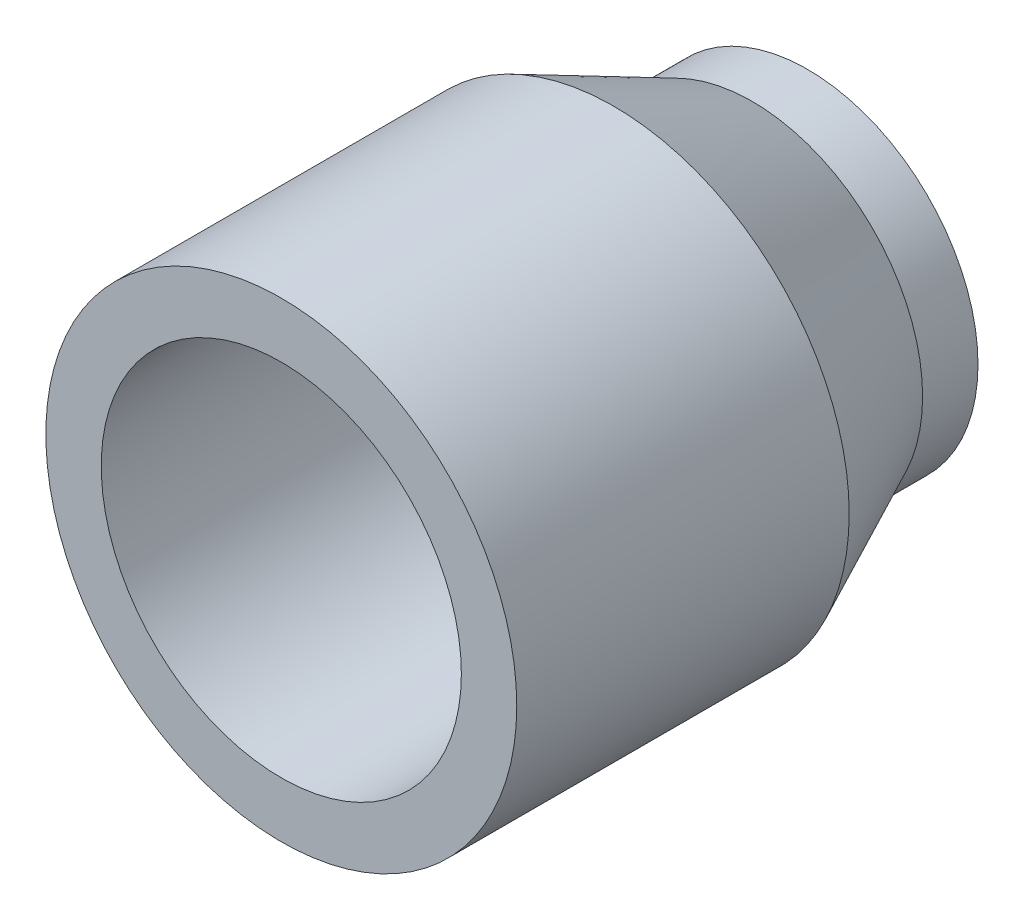
ISO-10303-21;
HEADER;
FILE_DESCRIPTION(('STEP AP214'),'2;1');
FILE_NAME('part.step','',(''),(''),'','','');
FILE_SCHEMA(('AUTOMOTIVE_DESIGN { 1 0 10303 214 1 1 1 1 }'));
ENDSEC;
DATA;
#1=APPLICATION_CONTEXT('core data for automotive mechanical design processes');
#2=APPLICATION_PROTOCOL_DEFINITION('international standard','automotive_design',2000,#1);
#3=PRODUCT_CONTEXT('',#1,'mechanical');
#4=PRODUCT('Part','Part','',(#3));
#5=PRODUCT_RELATED_PRODUCT_CATEGORY('part','',(#4));
#6=PRODUCT_DEFINITION_FORMATION('','',#4);
#7=PRODUCT_DEFINITION_CONTEXT('part definition',#1,'design');
#8=PRODUCT_DEFINITION('design','',#6,#7);
#9=PRODUCT_DEFINITION_SHAPE('','',#8);
#10=(LENGTH_UNIT() NAMED_UNIT(*) SI_UNIT(.MILLI.,.METRE.));
#11=(NAMED_UNIT(*) PLANE_ANGLE_UNIT() SI_UNIT($,.RADIAN.));
#12=(NAMED_UNIT(*) SI_UNIT($,.STERADIAN.) SOLID_ANGLE_UNIT());
#13=UNCERTAINTY_MEASURE_WITH_UNIT(LENGTH_MEASURE(1.E-05),#10,'distance_accuracy_value','');
#14=(GEOMETRIC_REPRESENTATION_CONTEXT(3) GLOBAL_UNCERTAINTY_ASSIGNED_CONTEXT((#13)) GLOBAL_UNIT_ASSIGNED_CONTEXT((#10,
#11,#12)) REPRESENTATION_CONTEXT('',''));
#15=CARTESIAN_POINT('',(0.,0.,0.));
#16=DIRECTION('',(0.,0.,1.));
#17=DIRECTION('',(1.,0.,0.));
#18=AXIS2_PLACEMENT_3D('',#15,#16,#17);
#19=CARTESIAN_POINT('',(0.,0.,0.));
#20=DIRECTION('',(0.,0.,1.));
#21=DIRECTION('',(1.,0.,0.));
#22=AXIS2_PLACEMENT_3D('',#19,#20,#21);
#23=CONICAL_SURFACE('',#22,6.15,0.439360887284591);
#24=CARTESIAN_POINT('',(0.,0.,0.));
#25=DIRECTION('',(0.,0.,1.));
#26=DIRECTION('',(1.,0.,0.));
#27=AXIS2_PLACEMENT_3D('',#24,#25,#26);
#28=CIRCLE('',#27,6.15);
#29=CARTESIAN_POINT('',(6.15,0.,0.));
#30=VERTEX_POINT('',#29);
#31=EDGE_CURVE('E69',#30,#30,#28,.T.);
#32=ORIENTED_EDGE('',*,*,#31,.T.);
#33=EDGE_LOOP('',(#32));
#34=FACE_BOUND('',#33,.T.);
#35=CARTESIAN_POINT('',(0.,0.,5.));
#36=DIRECTION('',(0.,0.,1.));
#37=DIRECTION('',(1.,0.,0.));
#38=AXIS2_PLACEMENT_3D('',#35,#36,#37);
#39=CIRCLE('',#38,8.5);
#40=CARTESIAN_POINT('',(8.5,0.,5.));
#41=VERTEX_POINT('',#40);
#42=EDGE_CURVE('E11',#41,#41,#39,.T.);
#43=ORIENTED_EDGE('',*,*,#42,.F.);
#44=EDGE_LOOP('',(#43));
#45=FACE_BOUND('',#44,.T.);
#46=ADVANCED_FACE('F35',(#34,#45),#23,.T.);
#47=CARTESIAN_POINT('',(0.,0.,0.));
#48=DIRECTION('',(0.,0.,1.));
#49=DIRECTION('',(1.,0.,0.));
#50=AXIS2_PLACEMENT_3D('',#47,#48,#49);
#51=CONICAL_SURFACE('',#50,4.15,0.439360887284591);
#52=CARTESIAN_POINT('',(0.,0.,0.));
#53=DIRECTION('',(0.,0.,1.));
#54=DIRECTION('',(1.,0.,0.));
#55=AXIS2_PLACEMENT_3D('',#52,#53,#54);
#56=CIRCLE('',#55,4.15);
#57=CARTESIAN_POINT('',(4.15,0.,0.));
#58=VERTEX_POINT('',#57);
#59=EDGE_CURVE('E43',#58,#58,#56,.T.);
#60=ORIENTED_EDGE('',*,*,#59,.F.);
#61=EDGE_LOOP('',(#60));
#62=FACE_BOUND('',#61,.T.);
#63=CARTESIAN_POINT('',(0.,0.,5.));
#64=DIRECTION('',(0.,0.,1.));
#65=DIRECTION('',(1.,0.,0.));
#66=AXIS2_PLACEMENT_3D('',#63,#64,#65);
#67=CIRCLE('',#66,6.5);
#68=CARTESIAN_POINT('',(6.5,0.,5.));
#69=VERTEX_POINT('',#68);
#70=EDGE_CURVE('E138',#69,#69,#67,.T.);
#71=ORIENTED_EDGE('',*,*,#70,.T.);
#72=EDGE_LOOP('',(#71));
#73=FACE_BOUND('',#72,.T.);
#74=ADVANCED_FACE('F85',(#62,#73),#51,.F.);
#75=CARTESIAN_POINT('',(0.,0.,-2.));
#76=DIRECTION('',(0.,0.,1.));
#77=DIRECTION('',(1.,0.,0.));
#78=AXIS2_PLACEMENT_3D('',#75,#76,#77);
#79=CYLINDRICAL_SURFACE('',#78,6.15);
#80=CARTESIAN_POINT('',(0.,0.,-2.));
#81=DIRECTION('',(0.,0.,1.));
#82=DIRECTION('',(1.,0.,0.));
#83=AXIS2_PLACEMENT_3D('',#80,#81,#82);
#84=CIRCLE('',#83,6.15);
#85=CARTESIAN_POINT('',(6.15,0.,-2.));
#86=VERTEX_POINT('',#85);
#87=EDGE_CURVE('E49',#86,#86,#84,.T.);
#88=ORIENTED_EDGE('',*,*,#87,.T.);
#89=EDGE_LOOP('',(#88));
#90=FACE_BOUND('',#89,.T.);
#91=ORIENTED_EDGE('',*,*,#31,.F.);
#92=EDGE_LOOP('',(#91));
#93=FACE_BOUND('',#92,.T.);
#94=ADVANCED_FACE('F75',(#90,#93),#79,.T.);
#95=CARTESIAN_POINT('',(0.,0.,-2.));
#96=DIRECTION('',(0.,0.,1.));
#97=DIRECTION('',(1.,0.,0.));
#98=AXIS2_PLACEMENT_3D('',#95,#96,#97);
#99=PLANE('',#98);
#100=CARTESIAN_POINT('',(0.,0.,-2.));
#101=DIRECTION('',(0.,0.,1.));
#102=DIRECTION('',(1.,0.,0.));
#103=AXIS2_PLACEMENT_3D('',#100,#101,#102);
#104=CIRCLE('',#103,4.15);
#105=CARTESIAN_POINT('',(4.15,0.,-2.));
#106=VERTEX_POINT('',#105);
#107=EDGE_CURVE('E151',#106,#106,#104,.T.);
#108=ORIENTED_EDGE('',*,*,#107,.T.);
#109=EDGE_LOOP('',(#108));
#110=FACE_BOUND('',#109,.T.);
#111=ORIENTED_EDGE('',*,*,#87,.F.);
#112=EDGE_LOOP('',(#111));
#113=FACE_BOUND('',#112,.T.);
#114=ADVANCED_FACE('F84',(#110,#113),#99,.F.);
#115=CARTESIAN_POINT('',(0.,0.,-2.));
#116=DIRECTION('',(0.,0.,1.));
#117=DIRECTION('',(1.,0.,0.));
#118=AXIS2_PLACEMENT_3D('',#115,#116,#117);
#119=CYLINDRICAL_SURFACE('',#118,4.15);
#120=ORIENTED_EDGE('',*,*,#107,.F.);
#121=EDGE_LOOP('',(#120));
#122=FACE_BOUND('',#121,.T.);
#123=ORIENTED_EDGE('',*,*,#59,.T.);
#124=EDGE_LOOP('',(#123));
#125=FACE_BOUND('',#124,.T.);
#126=ADVANCED_FACE('F114',(#122,#125),#119,.F.);
#127=CARTESIAN_POINT('',(0.,0.,17.));
#128=DIRECTION('',(0.,0.,1.));
#129=DIRECTION('',(1.,0.,0.));
#130=AXIS2_PLACEMENT_3D('',#127,#128,#129);
#131=PLANE('',#130);
#132=CARTESIAN_POINT('',(0.,0.,17.));
#133=DIRECTION('',(0.,0.,1.));
#134=DIRECTION('',(1.,0.,0.));
#135=AXIS2_PLACEMENT_3D('',#132,#133,#134);
#136=CIRCLE('',#135,8.5);
#137=CARTESIAN_POINT('',(8.5,0.,17.));
#138=VERTEX_POINT('',#137);
#139=EDGE_CURVE('E147',#138,#138,#136,.T.);
#140=ORIENTED_EDGE('',*,*,#139,.T.);
#141=EDGE_LOOP('',(#140));
#142=FACE_BOUND('',#141,.T.);
#143=CARTESIAN_POINT('',(0.,0.,17.));
#144=DIRECTION('',(0.,0.,1.));
#145=DIRECTION('',(1.,0.,0.));
#146=AXIS2_PLACEMENT_3D('',#143,#144,#145);
#147=CIRCLE('',#146,6.5);
#148=CARTESIAN_POINT('',(6.5,0.,17.));
#149=VERTEX_POINT('',#148);
#150=EDGE_CURVE('E144',#149,#149,#147,.T.);
#151=ORIENTED_EDGE('',*,*,#150,.F.);
#152=EDGE_LOOP('',(#151));
#153=FACE_BOUND('',#152,.T.);
#154=ADVANCED_FACE('F122',(#142,#153),#131,.T.);
#155=CARTESIAN_POINT('',(0.,0.,17.));
#156=DIRECTION('',(0.,0.,-1.));
#157=DIRECTION('',(-1.,0.,0.));
#158=AXIS2_PLACEMENT_3D('',#155,#156,#157);
#159=CYLINDRICAL_SURFACE('',#158,8.5);
#160=ORIENTED_EDGE('',*,*,#139,.F.);
#161=EDGE_LOOP('',(#160));
#162=FACE_BOUND('',#161,.T.);
#163=ORIENTED_EDGE('',*,*,#42,.T.);
#164=EDGE_LOOP('',(#163));
#165=FACE_BOUND('',#164,.T.);
#166=ADVANCED_FACE('F124',(#162,#165),#159,.T.);
#167=CARTESIAN_POINT('',(0.,0.,17.));
#168=DIRECTION('',(0.,0.,-1.));
#169=DIRECTION('',(-1.,0.,0.));
#170=AXIS2_PLACEMENT_3D('',#167,#168,#169);
#171=CYLINDRICAL_SURFACE('',#170,6.5);
#172=ORIENTED_EDGE('',*,*,#150,.T.);
#173=EDGE_LOOP('',(#172));
#174=FACE_BOUND('',#173,.T.);
#175=ORIENTED_EDGE('',*,*,#70,.F.);
#176=EDGE_LOOP('',(#175));
#177=FACE_BOUND('',#176,.T.);
#178=ADVANCED_FACE('F128',(#174,#177),#171,.F.);
#179=CLOSED_SHELL('',(#46,#74,#94,#114,#126,#154,#166,#178));
#180=MANIFOLD_SOLID_BREP('B2',#179);
#181=ADVANCED_BREP_SHAPE_REPRESENTATION('',(#18,#180),#14);
#182=SHAPE_DEFINITION_REPRESENTATION(#9,#181);
ENDSEC;
END-ISO-10303-21;
